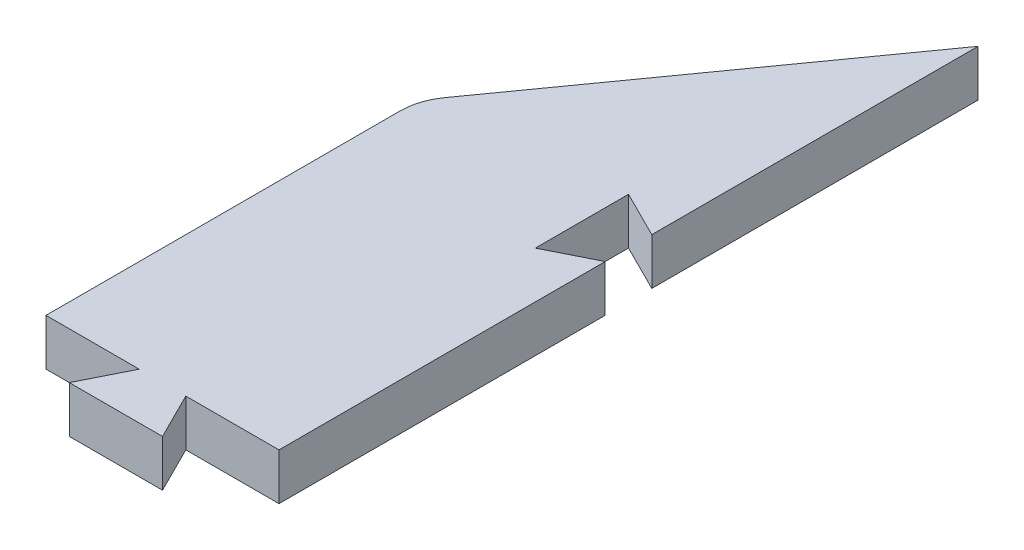
ISO-10303-21;
HEADER;
FILE_DESCRIPTION(('STEP AP214'),'2;1');
FILE_NAME('part.step','',(''),(''),'','','');
FILE_SCHEMA(('AUTOMOTIVE_DESIGN { 1 0 10303 214 1 1 1 1 }'));
ENDSEC;
DATA;
#1=APPLICATION_CONTEXT('core data for automotive mechanical design processes');
#2=APPLICATION_PROTOCOL_DEFINITION('international standard','automotive_design',2000,#1);
#3=PRODUCT_CONTEXT('',#1,'mechanical');
#4=PRODUCT('Part','Part','',(#3));
#5=PRODUCT_RELATED_PRODUCT_CATEGORY('part','',(#4));
#6=PRODUCT_DEFINITION_FORMATION('','',#4);
#7=PRODUCT_DEFINITION_CONTEXT('part definition',#1,'design');
#8=PRODUCT_DEFINITION('design','',#6,#7);
#9=PRODUCT_DEFINITION_SHAPE('','',#8);
#10=(LENGTH_UNIT() NAMED_UNIT(*) SI_UNIT(.MILLI.,.METRE.));
#11=(NAMED_UNIT(*) PLANE_ANGLE_UNIT() SI_UNIT($,.RADIAN.));
#12=(NAMED_UNIT(*) SI_UNIT($,.STERADIAN.) SOLID_ANGLE_UNIT());
#13=UNCERTAINTY_MEASURE_WITH_UNIT(LENGTH_MEASURE(1.E-05),#10,'distance_accuracy_value','');
#14=(GEOMETRIC_REPRESENTATION_CONTEXT(3) GLOBAL_UNCERTAINTY_ASSIGNED_CONTEXT((#13)) GLOBAL_UNIT_ASSIGNED_CONTEXT((#10,
#11,#12)) REPRESENTATION_CONTEXT('',''));
#15=CARTESIAN_POINT('',(0.,0.,0.));
#16=DIRECTION('',(0.,0.,1.));
#17=DIRECTION('',(1.,0.,0.));
#18=AXIS2_PLACEMENT_3D('',#15,#16,#17);
#19=CARTESIAN_POINT('',(-2.,4.,17.5));
#20=DIRECTION('',(0.,0.,1.));
#21=DIRECTION('',(1.,0.,0.));
#22=AXIS2_PLACEMENT_3D('',#19,#20,#21);
#23=PLANE('',#22);
#24=DIRECTION('',(-1.,0.,0.));
#25=VECTOR('',#24,1.);
#26=CARTESIAN_POINT('',(-2.,0.,17.5));
#27=LINE('',#26,#25);
#28=CARTESIAN_POINT('',(-2.,0.,17.5));
#29=VERTEX_POINT('',#28);
#30=CARTESIAN_POINT('',(-10.,0.,17.5));
#31=VERTEX_POINT('',#30);
#32=EDGE_CURVE('E162',#29,#31,#27,.T.);
#33=ORIENTED_EDGE('',*,*,#32,.F.);
#34=DIRECTION('',(0.,-1.,0.));
#35=VECTOR('',#34,1.);
#36=CARTESIAN_POINT('',(-2.,4.,17.5));
#37=LINE('',#36,#35);
#38=CARTESIAN_POINT('',(-2.,4.,17.5));
#39=VERTEX_POINT('',#38);
#40=EDGE_CURVE('E11',#39,#29,#37,.T.);
#41=ORIENTED_EDGE('',*,*,#40,.F.);
#42=DIRECTION('',(-1.,0.,0.));
#43=VECTOR('',#42,1.);
#44=CARTESIAN_POINT('',(-2.,4.,17.5));
#45=LINE('',#44,#43);
#46=CARTESIAN_POINT('',(-10.,4.,17.5));
#47=VERTEX_POINT('',#46);
#48=EDGE_CURVE('E196',#39,#47,#45,.T.);
#49=ORIENTED_EDGE('',*,*,#48,.T.);
#50=DIRECTION('',(0.,-1.,0.));
#51=VECTOR('',#50,1.);
#52=CARTESIAN_POINT('',(-10.,4.,17.5));
#53=LINE('',#52,#51);
#54=EDGE_CURVE('E38',#47,#31,#53,.T.);
#55=ORIENTED_EDGE('',*,*,#54,.T.);
#56=EDGE_LOOP('',(#33,#41,#49,#55));
#57=FACE_BOUND('',#56,.T.);
#58=ADVANCED_FACE('F35',(#57),#23,.T.);
#59=CARTESIAN_POINT('',(-4.,4.,21.5));
#60=DIRECTION('',(-0.894427190999916,0.,-0.447213595499958));
#61=DIRECTION('',(-0.447213595499958,0.,0.894427190999916));
#62=AXIS2_PLACEMENT_3D('',#59,#60,#61);
#63=PLANE('',#62);
#64=DIRECTION('',(0.447213595499958,0.,-0.894427190999916));
#65=VECTOR('',#64,1.);
#66=CARTESIAN_POINT('',(-4.,0.,21.5));
#67=LINE('',#66,#65);
#68=CARTESIAN_POINT('',(-4.,0.,21.5));
#69=VERTEX_POINT('',#68);
#70=EDGE_CURVE('E194',#69,#29,#67,.T.);
#71=ORIENTED_EDGE('',*,*,#70,.F.);
#72=DIRECTION('',(0.,-1.,0.));
#73=VECTOR('',#72,1.);
#74=CARTESIAN_POINT('',(-4.,4.,21.5));
#75=LINE('',#74,#73);
#76=CARTESIAN_POINT('',(-4.,4.,21.5));
#77=VERTEX_POINT('',#76);
#78=EDGE_CURVE('E44',#77,#69,#75,.T.);
#79=ORIENTED_EDGE('',*,*,#78,.F.);
#80=DIRECTION('',(0.447213595499958,0.,-0.894427190999916));
#81=VECTOR('',#80,1.);
#82=CARTESIAN_POINT('',(-4.,4.,21.5));
#83=LINE('',#82,#81);
#84=EDGE_CURVE('E142',#77,#39,#83,.T.);
#85=ORIENTED_EDGE('',*,*,#84,.T.);
#86=ORIENTED_EDGE('',*,*,#40,.T.);
#87=EDGE_LOOP('',(#71,#79,#85,#86));
#88=FACE_BOUND('',#87,.T.);
#89=ADVANCED_FACE('F219',(#88),#63,.T.);
#90=CARTESIAN_POINT('',(-4.,4.,21.5));
#91=DIRECTION('',(0.,0.,-1.));
#92=DIRECTION('',(-1.,0.,0.));
#93=AXIS2_PLACEMENT_3D('',#90,#91,#92);
#94=PLANE('',#93);
#95=DIRECTION('',(1.,0.,0.));
#96=VECTOR('',#95,1.);
#97=CARTESIAN_POINT('',(-4.,0.,21.5));
#98=LINE('',#97,#96);
#99=CARTESIAN_POINT('',(4.,0.,21.5));
#100=VERTEX_POINT('',#99);
#101=EDGE_CURVE('E147',#69,#100,#98,.T.);
#102=ORIENTED_EDGE('',*,*,#101,.T.);
#103=DIRECTION('',(0.,-1.,0.));
#104=VECTOR('',#103,1.);
#105=CARTESIAN_POINT('',(4.,4.,21.5));
#106=LINE('',#105,#104);
#107=CARTESIAN_POINT('',(4.,4.,21.5));
#108=VERTEX_POINT('',#107);
#109=EDGE_CURVE('E145',#108,#100,#106,.T.);
#110=ORIENTED_EDGE('',*,*,#109,.F.);
#111=DIRECTION('',(1.,0.,0.));
#112=VECTOR('',#111,1.);
#113=CARTESIAN_POINT('',(-4.,4.,21.5));
#114=LINE('',#113,#112);
#115=EDGE_CURVE('E135',#77,#108,#114,.T.);
#116=ORIENTED_EDGE('',*,*,#115,.F.);
#117=ORIENTED_EDGE('',*,*,#78,.T.);
#118=EDGE_LOOP('',(#102,#110,#116,#117));
#119=FACE_BOUND('',#118,.T.);
#120=ADVANCED_FACE('F146',(#119),#94,.F.);
#121=CARTESIAN_POINT('',(4.,4.,21.5));
#122=DIRECTION('',(-0.894427190999916,0.,0.447213595499958));
#123=DIRECTION('',(0.447213595499958,0.,0.894427190999916));
#124=AXIS2_PLACEMENT_3D('',#121,#122,#123);
#125=PLANE('',#124);
#126=DIRECTION('',(-0.447213595499958,0.,-0.894427190999916));
#127=VECTOR('',#126,1.);
#128=CARTESIAN_POINT('',(4.,0.,21.5));
#129=LINE('',#128,#127);
#130=CARTESIAN_POINT('',(2.,0.,17.5));
#131=VERTEX_POINT('',#130);
#132=EDGE_CURVE('E191',#100,#131,#129,.T.);
#133=ORIENTED_EDGE('',*,*,#132,.T.);
#134=DIRECTION('',(0.,-1.,0.));
#135=VECTOR('',#134,1.);
#136=CARTESIAN_POINT('',(2.,4.,17.5));
#137=LINE('',#136,#135);
#138=CARTESIAN_POINT('',(2.,4.,17.5));
#139=VERTEX_POINT('',#138);
#140=EDGE_CURVE('E151',#139,#131,#137,.T.);
#141=ORIENTED_EDGE('',*,*,#140,.F.);
#142=DIRECTION('',(-0.447213595499958,0.,-0.894427190999916));
#143=VECTOR('',#142,1.);
#144=CARTESIAN_POINT('',(4.,4.,21.5));
#145=LINE('',#144,#143);
#146=EDGE_CURVE('E140',#108,#139,#145,.T.);
#147=ORIENTED_EDGE('',*,*,#146,.F.);
#148=ORIENTED_EDGE('',*,*,#109,.T.);
#149=EDGE_LOOP('',(#133,#141,#147,#148));
#150=FACE_BOUND('',#149,.T.);
#151=ADVANCED_FACE('F153',(#150),#125,.F.);
#152=CARTESIAN_POINT('',(10.,4.,17.5));
#153=DIRECTION('',(0.,0.,1.));
#154=DIRECTION('',(1.,0.,0.));
#155=AXIS2_PLACEMENT_3D('',#152,#153,#154);
#156=PLANE('',#155);
#157=DIRECTION('',(-1.,0.,0.));
#158=VECTOR('',#157,1.);
#159=CARTESIAN_POINT('',(10.,0.,17.5));
#160=LINE('',#159,#158);
#161=CARTESIAN_POINT('',(10.,0.,17.5));
#162=VERTEX_POINT('',#161);
#163=EDGE_CURVE('E188',#162,#131,#160,.T.);
#164=ORIENTED_EDGE('',*,*,#163,.F.);
#165=DIRECTION('',(0.,-1.,0.));
#166=VECTOR('',#165,1.);
#167=CARTESIAN_POINT('',(10.,4.,17.5));
#168=LINE('',#167,#166);
#169=CARTESIAN_POINT('',(10.,4.,17.5));
#170=VERTEX_POINT('',#169);
#171=EDGE_CURVE('E200',#170,#162,#168,.T.);
#172=ORIENTED_EDGE('',*,*,#171,.F.);
#173=DIRECTION('',(-1.,0.,0.));
#174=VECTOR('',#173,1.);
#175=CARTESIAN_POINT('',(10.,4.,17.5));
#176=LINE('',#175,#174);
#177=EDGE_CURVE('E155',#170,#139,#176,.T.);
#178=ORIENTED_EDGE('',*,*,#177,.T.);
#179=ORIENTED_EDGE('',*,*,#140,.T.);
#180=EDGE_LOOP('',(#164,#172,#178,#179));
#181=FACE_BOUND('',#180,.T.);
#182=ADVANCED_FACE('F232',(#181),#156,.T.);
#183=CARTESIAN_POINT('',(10.,4.,17.5));
#184=DIRECTION('',(-1.,0.,0.));
#185=DIRECTION('',(0.,0.,1.));
#186=AXIS2_PLACEMENT_3D('',#183,#184,#185);
#187=PLANE('',#186);
#188=DIRECTION('',(0.,0.,-1.));
#189=VECTOR('',#188,1.);
#190=CARTESIAN_POINT('',(10.,0.,17.5));
#191=LINE('',#190,#189);
#192=CARTESIAN_POINT('',(9.99999999999999,0.,-10.5));
#193=VERTEX_POINT('',#192);
#194=EDGE_CURVE('E185',#162,#193,#191,.T.);
#195=ORIENTED_EDGE('',*,*,#194,.T.);
#196=DIRECTION('',(0.,-1.,0.));
#197=VECTOR('',#196,1.);
#198=CARTESIAN_POINT('',(9.99999999999999,4.,-10.5));
#199=LINE('',#198,#197);
#200=CARTESIAN_POINT('',(9.99999999999999,4.,-10.5));
#201=VERTEX_POINT('',#200);
#202=EDGE_CURVE('E202',#201,#193,#199,.T.);
#203=ORIENTED_EDGE('',*,*,#202,.F.);
#204=DIRECTION('',(0.,0.,-1.));
#205=VECTOR('',#204,1.);
#206=CARTESIAN_POINT('',(10.,4.,17.5));
#207=LINE('',#206,#205);
#208=EDGE_CURVE('E157',#170,#201,#207,.T.);
#209=ORIENTED_EDGE('',*,*,#208,.F.);
#210=ORIENTED_EDGE('',*,*,#171,.T.);
#211=EDGE_LOOP('',(#195,#203,#209,#210));
#212=FACE_BOUND('',#211,.T.);
#213=ADVANCED_FACE('F235',(#212),#187,.F.);
#214=CARTESIAN_POINT('',(6.00000000000001,4.,-8.49999999999993));
#215=DIRECTION('',(-0.447213595499969,0.,-0.89442719099991));
#216=DIRECTION('',(-0.89442719099991,0.,0.447213595499969));
#217=AXIS2_PLACEMENT_3D('',#214,#215,#216);
#218=PLANE('',#217);
#219=DIRECTION('',(0.89442719099991,0.,-0.447213595499969));
#220=VECTOR('',#219,1.);
#221=CARTESIAN_POINT('',(6.00000000000001,0.,-8.49999999999993));
#222=LINE('',#221,#220);
#223=CARTESIAN_POINT('',(6.00000000000001,0.,-8.49999999999993));
#224=VERTEX_POINT('',#223);
#225=EDGE_CURVE('E182',#224,#193,#222,.T.);
#226=ORIENTED_EDGE('',*,*,#225,.F.);
#227=DIRECTION('',(0.,-1.,0.));
#228=VECTOR('',#227,1.);
#229=CARTESIAN_POINT('',(6.00000000000001,4.,-8.49999999999993));
#230=LINE('',#229,#228);
#231=CARTESIAN_POINT('',(6.00000000000001,4.,-8.49999999999993));
#232=VERTEX_POINT('',#231);
#233=EDGE_CURVE('E204',#232,#224,#230,.T.);
#234=ORIENTED_EDGE('',*,*,#233,.F.);
#235=DIRECTION('',(0.89442719099991,0.,-0.447213595499969));
#236=VECTOR('',#235,1.);
#237=CARTESIAN_POINT('',(6.00000000000001,4.,-8.49999999999993));
#238=LINE('',#237,#236);
#239=EDGE_CURVE('E379',#232,#201,#238,.T.);
#240=ORIENTED_EDGE('',*,*,#239,.T.);
#241=ORIENTED_EDGE('',*,*,#202,.T.);
#242=EDGE_LOOP('',(#226,#234,#240,#241));
#243=FACE_BOUND('',#242,.T.);
#244=ADVANCED_FACE('F239',(#243),#218,.T.);
#245=CARTESIAN_POINT('',(6.00000000000001,4.,-16.5000000000001));
#246=DIRECTION('',(1.,0.,0.));
#247=DIRECTION('',(0.,0.,-1.));
#248=AXIS2_PLACEMENT_3D('',#245,#246,#247);
#249=PLANE('',#248);
#250=DIRECTION('',(0.,0.,1.));
#251=VECTOR('',#250,1.);
#252=CARTESIAN_POINT('',(6.00000000000001,0.,-16.5000000000001));
#253=LINE('',#252,#251);
#254=CARTESIAN_POINT('',(6.00000000000001,0.,-16.5000000000001));
#255=VERTEX_POINT('',#254);
#256=EDGE_CURVE('E179',#255,#224,#253,.T.);
#257=ORIENTED_EDGE('',*,*,#256,.F.);
#258=DIRECTION('',(0.,-1.,0.));
#259=VECTOR('',#258,1.);
#260=CARTESIAN_POINT('',(6.00000000000001,4.,-16.5000000000001));
#261=LINE('',#260,#259);
#262=CARTESIAN_POINT('',(6.00000000000001,4.,-16.5000000000001));
#263=VERTEX_POINT('',#262);
#264=EDGE_CURVE('E206',#263,#255,#261,.T.);
#265=ORIENTED_EDGE('',*,*,#264,.F.);
#266=DIRECTION('',(0.,0.,1.));
#267=VECTOR('',#266,1.);
#268=CARTESIAN_POINT('',(6.00000000000001,4.,-16.5000000000001));
#269=LINE('',#268,#267);
#270=EDGE_CURVE('E372',#263,#232,#269,.T.);
#271=ORIENTED_EDGE('',*,*,#270,.T.);
#272=ORIENTED_EDGE('',*,*,#233,.T.);
#273=EDGE_LOOP('',(#257,#265,#271,#272));
#274=FACE_BOUND('',#273,.T.);
#275=ADVANCED_FACE('F243',(#274),#249,.T.);
#276=CARTESIAN_POINT('',(6.00000000000001,4.,-16.5000000000001));
#277=DIRECTION('',(0.44721359549995,0.,-0.89442719099992));
#278=DIRECTION('',(-0.89442719099992,0.,-0.44721359549995));
#279=AXIS2_PLACEMENT_3D('',#276,#277,#278);
#280=PLANE('',#279);
#281=DIRECTION('',(0.89442719099992,0.,0.44721359549995));
#282=VECTOR('',#281,1.);
#283=CARTESIAN_POINT('',(6.00000000000001,0.,-16.5000000000001));
#284=LINE('',#283,#282);
#285=CARTESIAN_POINT('',(9.99999999999999,0.,-14.5000000000001));
#286=VERTEX_POINT('',#285);
#287=EDGE_CURVE('E177',#255,#286,#284,.T.);
#288=ORIENTED_EDGE('',*,*,#287,.T.);
#289=DIRECTION('',(0.,-1.,0.));
#290=VECTOR('',#289,1.);
#291=CARTESIAN_POINT('',(9.99999999999999,4.,-14.5000000000001));
#292=LINE('',#291,#290);
#293=CARTESIAN_POINT('',(9.99999999999999,4.,-14.5000000000001));
#294=VERTEX_POINT('',#293);
#295=EDGE_CURVE('E208',#294,#286,#292,.T.);
#296=ORIENTED_EDGE('',*,*,#295,.F.);
#297=DIRECTION('',(0.89442719099992,0.,0.44721359549995));
#298=VECTOR('',#297,1.);
#299=CARTESIAN_POINT('',(6.00000000000001,4.,-16.5000000000001));
#300=LINE('',#299,#298);
#301=EDGE_CURVE('E367',#263,#294,#300,.T.);
#302=ORIENTED_EDGE('',*,*,#301,.F.);
#303=ORIENTED_EDGE('',*,*,#264,.T.);
#304=EDGE_LOOP('',(#288,#296,#302,#303));
#305=FACE_BOUND('',#304,.T.);
#306=ADVANCED_FACE('F247',(#305),#280,.F.);
#307=CARTESIAN_POINT('',(9.99999999999999,4.,-14.5000000000001));
#308=DIRECTION('',(-1.,0.,0.));
#309=DIRECTION('',(0.,0.,1.));
#310=AXIS2_PLACEMENT_3D('',#307,#308,#309);
#311=PLANE('',#310);
#312=DIRECTION('',(0.,0.,-1.));
#313=VECTOR('',#312,1.);
#314=CARTESIAN_POINT('',(9.99999999999999,0.,-14.5000000000001));
#315=LINE('',#314,#313);
#316=CARTESIAN_POINT('',(10.,0.,-42.5));
#317=VERTEX_POINT('',#316);
#318=EDGE_CURVE('E174',#286,#317,#315,.T.);
#319=ORIENTED_EDGE('',*,*,#318,.T.);
#320=DIRECTION('',(0.,-1.,0.));
#321=VECTOR('',#320,1.);
#322=CARTESIAN_POINT('',(10.,4.,-42.5));
#323=LINE('',#322,#321);
#324=CARTESIAN_POINT('',(10.,4.,-42.5));
#325=VERTEX_POINT('',#324);
#326=EDGE_CURVE('E211',#325,#317,#323,.T.);
#327=ORIENTED_EDGE('',*,*,#326,.F.);
#328=DIRECTION('',(0.,0.,-1.));
#329=VECTOR('',#328,1.);
#330=CARTESIAN_POINT('',(9.99999999999999,4.,-14.5000000000001));
#331=LINE('',#330,#329);
#332=EDGE_CURVE('E365',#294,#325,#331,.T.);
#333=ORIENTED_EDGE('',*,*,#332,.F.);
#334=ORIENTED_EDGE('',*,*,#295,.T.);
#335=EDGE_LOOP('',(#319,#327,#333,#334));
#336=FACE_BOUND('',#335,.T.);
#337=ADVANCED_FACE('F251',(#336),#311,.F.);
#338=CARTESIAN_POINT('',(-9.06866735603366,4.,-15.803865701553));
#339=DIRECTION('',(-0.813733471206734,0.,-0.581238193719098));
#340=DIRECTION('',(-0.581238193719098,0.,0.813733471206734));
#341=AXIS2_PLACEMENT_3D('',#338,#339,#340);
#342=PLANE('',#341);
#343=DIRECTION('',(0.581238193719098,0.,-0.813733471206734));
#344=VECTOR('',#343,1.);
#345=CARTESIAN_POINT('',(-9.06866735603366,0.,-15.803865701553));
#346=LINE('',#345,#344);
#347=CARTESIAN_POINT('',(-9.06866735603366,0.,-15.803865701553));
#348=VERTEX_POINT('',#347);
#349=EDGE_CURVE('E171',#348,#317,#346,.T.);
#350=ORIENTED_EDGE('',*,*,#349,.F.);
#351=DIRECTION('',(0.,-1.,0.));
#352=VECTOR('',#351,1.);
#353=CARTESIAN_POINT('',(-9.06866735603366,4.,-15.803865701553));
#354=LINE('',#353,#352);
#355=CARTESIAN_POINT('',(-9.06866735603366,4.,-15.803865701553));
#356=VERTEX_POINT('',#355);
#357=EDGE_CURVE('E213',#356,#348,#354,.T.);
#358=ORIENTED_EDGE('',*,*,#357,.F.);
#359=DIRECTION('',(0.581238193719098,0.,-0.813733471206734));
#360=VECTOR('',#359,1.);
#361=CARTESIAN_POINT('',(-9.06866735603366,4.,-15.803865701553));
#362=LINE('',#361,#360);
#363=EDGE_CURVE('E362',#356,#325,#362,.T.);
#364=ORIENTED_EDGE('',*,*,#363,.T.);
#365=ORIENTED_EDGE('',*,*,#326,.T.);
#366=EDGE_LOOP('',(#350,#358,#364,#365));
#367=FACE_BOUND('',#366,.T.);
#368=ADVANCED_FACE('F255',(#367),#342,.T.);
#369=CARTESIAN_POINT('',(-5.,4.,-12.8976747329575));
#370=DIRECTION('',(0.,-1.,0.));
#371=DIRECTION('',(0.,0.,-1.));
#372=AXIS2_PLACEMENT_3D('',#369,#370,#371);
#373=CYLINDRICAL_SURFACE('',#372,5.);
#374=CARTESIAN_POINT('',(-5.,0.,-12.8976747329575));
#375=DIRECTION('',(0.,-1.,0.));
#376=DIRECTION('',(0.,0.,-1.));
#377=AXIS2_PLACEMENT_3D('',#374,#375,#376);
#378=CIRCLE('',#377,5.);
#379=CARTESIAN_POINT('',(-10.,0.,-12.8976747329574));
#380=VERTEX_POINT('',#379);
#381=EDGE_CURVE('E168',#380,#348,#378,.T.);
#382=ORIENTED_EDGE('',*,*,#381,.F.);
#383=DIRECTION('',(0.,-1.,0.));
#384=VECTOR('',#383,1.);
#385=CARTESIAN_POINT('',(-10.,4.,-12.8976747329574));
#386=LINE('',#385,#384);
#387=CARTESIAN_POINT('',(-10.,4.,-12.8976747329574));
#388=VERTEX_POINT('',#387);
#389=EDGE_CURVE('E214',#388,#380,#386,.T.);
#390=ORIENTED_EDGE('',*,*,#389,.F.);
#391=CARTESIAN_POINT('',(-5.,4.,-12.8976747329575));
#392=DIRECTION('',(0.,-1.,0.));
#393=DIRECTION('',(0.,0.,-1.));
#394=AXIS2_PLACEMENT_3D('',#391,#392,#393);
#395=CIRCLE('',#394,5.);
#396=EDGE_CURVE('E386',#388,#356,#395,.T.);
#397=ORIENTED_EDGE('',*,*,#396,.T.);
#398=ORIENTED_EDGE('',*,*,#357,.T.);
#399=EDGE_LOOP('',(#382,#390,#397,#398));
#400=FACE_BOUND('',#399,.T.);
#401=ADVANCED_FACE('F259',(#400),#373,.T.);
#402=CARTESIAN_POINT('',(-10.,4.,17.5));
#403=DIRECTION('',(-1.,0.,0.));
#404=DIRECTION('',(0.,0.,1.));
#405=AXIS2_PLACEMENT_3D('',#402,#403,#404);
#406=PLANE('',#405);
#407=DIRECTION('',(0.,0.,-1.));
#408=VECTOR('',#407,1.);
#409=CARTESIAN_POINT('',(-10.,0.,17.5));
#410=LINE('',#409,#408);
#411=EDGE_CURVE('E165',#31,#380,#410,.T.);
#412=ORIENTED_EDGE('',*,*,#411,.F.);
#413=ORIENTED_EDGE('',*,*,#54,.F.);
#414=DIRECTION('',(0.,0.,-1.));
#415=VECTOR('',#414,1.);
#416=CARTESIAN_POINT('',(-10.,4.,17.5));
#417=LINE('',#416,#415);
#418=EDGE_CURVE('E388',#47,#388,#417,.T.);
#419=ORIENTED_EDGE('',*,*,#418,.T.);
#420=ORIENTED_EDGE('',*,*,#389,.T.);
#421=EDGE_LOOP('',(#412,#413,#419,#420));
#422=FACE_BOUND('',#421,.T.);
#423=ADVANCED_FACE('F216',(#422),#406,.T.);
#424=CARTESIAN_POINT('',(-5.,4.,-12.8976747329575));
#425=DIRECTION('',(0.,-1.,0.));
#426=DIRECTION('',(0.,0.,-1.));
#427=AXIS2_PLACEMENT_3D('',#424,#425,#426);
#428=PLANE('',#427);
#429=ORIENTED_EDGE('',*,*,#48,.F.);
#430=ORIENTED_EDGE('',*,*,#84,.F.);
#431=ORIENTED_EDGE('',*,*,#115,.T.);
#432=ORIENTED_EDGE('',*,*,#146,.T.);
#433=ORIENTED_EDGE('',*,*,#177,.F.);
#434=ORIENTED_EDGE('',*,*,#208,.T.);
#435=ORIENTED_EDGE('',*,*,#239,.F.);
#436=ORIENTED_EDGE('',*,*,#270,.F.);
#437=ORIENTED_EDGE('',*,*,#301,.T.);
#438=ORIENTED_EDGE('',*,*,#332,.T.);
#439=ORIENTED_EDGE('',*,*,#363,.F.);
#440=ORIENTED_EDGE('',*,*,#396,.F.);
#441=ORIENTED_EDGE('',*,*,#418,.F.);
#442=EDGE_LOOP('',(#429,#430,#431,#432,#433,#434,#435,#436,#437,#438,#439,#440,#441));
#443=FACE_BOUND('',#442,.T.);
#444=ADVANCED_FACE('F137',(#443),#428,.F.);
#445=CARTESIAN_POINT('',(-5.,0.,-12.8976747329575));
#446=DIRECTION('',(0.,-1.,0.));
#447=DIRECTION('',(0.,0.,-1.));
#448=AXIS2_PLACEMENT_3D('',#445,#446,#447);
#449=PLANE('',#448);
#450=ORIENTED_EDGE('',*,*,#32,.T.);
#451=ORIENTED_EDGE('',*,*,#411,.T.);
#452=ORIENTED_EDGE('',*,*,#381,.T.);
#453=ORIENTED_EDGE('',*,*,#349,.T.);
#454=ORIENTED_EDGE('',*,*,#318,.F.);
#455=ORIENTED_EDGE('',*,*,#287,.F.);
#456=ORIENTED_EDGE('',*,*,#256,.T.);
#457=ORIENTED_EDGE('',*,*,#225,.T.);
#458=ORIENTED_EDGE('',*,*,#194,.F.);
#459=ORIENTED_EDGE('',*,*,#163,.T.);
#460=ORIENTED_EDGE('',*,*,#132,.F.);
#461=ORIENTED_EDGE('',*,*,#101,.F.);
#462=ORIENTED_EDGE('',*,*,#70,.T.);
#463=EDGE_LOOP('',(#450,#451,#452,#453,#454,#455,#456,#457,#458,#459,#460,#461,#462));
#464=FACE_BOUND('',#463,.T.);
#465=ADVANCED_FACE('F218',(#464),#449,.T.);
#466=CLOSED_SHELL('',(#58,#89,#120,#151,#182,#213,#244,#275,#306,#337,#368,#401,#423,#444,#465));
#467=MANIFOLD_SOLID_BREP('B2',#466);
#468=ADVANCED_BREP_SHAPE_REPRESENTATION('',(#18,#467),#14);
#469=SHAPE_DEFINITION_REPRESENTATION(#9,#468);
ENDSEC;
END-ISO-10303-21;
